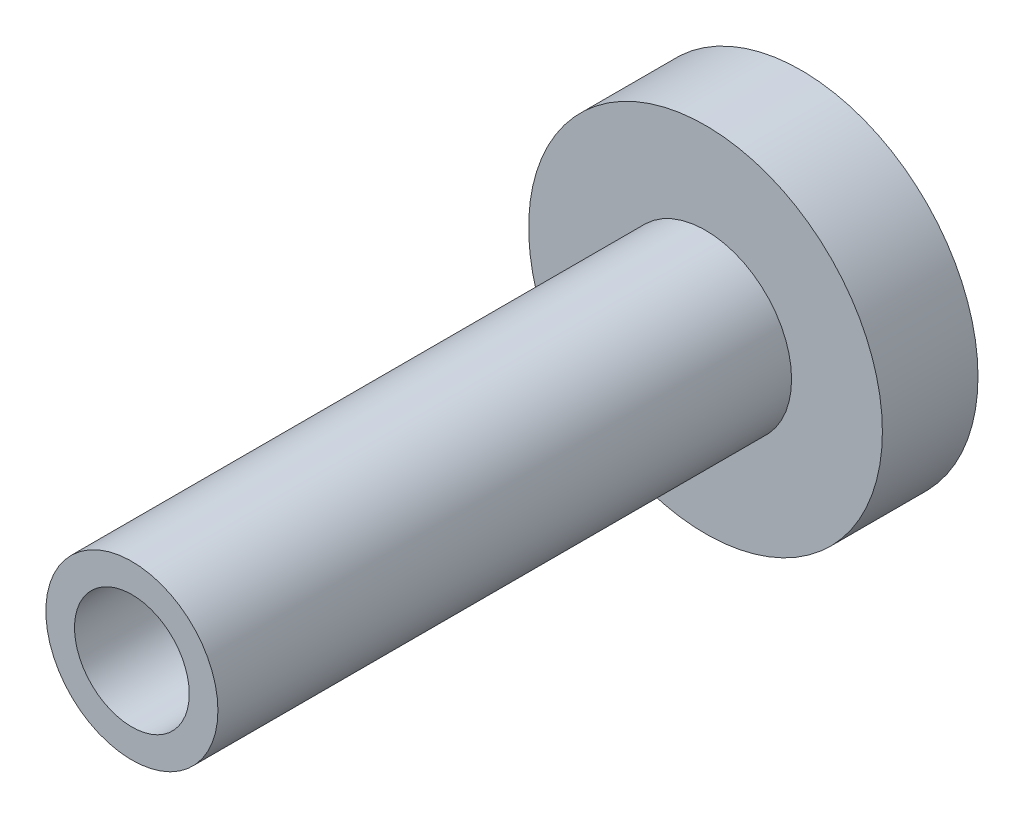
ISO-10303-21;
HEADER;
FILE_DESCRIPTION(('STEP AP214'),'2;1');
FILE_NAME('part.step','',(''),(''),'','','');
FILE_SCHEMA(('AUTOMOTIVE_DESIGN { 1 0 10303 214 1 1 1 1 }'));
ENDSEC;
DATA;
#1=APPLICATION_CONTEXT('core data for automotive mechanical design processes');
#2=APPLICATION_PROTOCOL_DEFINITION('international standard','automotive_design',2000,#1);
#3=PRODUCT_CONTEXT('',#1,'mechanical');
#4=PRODUCT('Part','Part','',(#3));
#5=PRODUCT_RELATED_PRODUCT_CATEGORY('part','',(#4));
#6=PRODUCT_DEFINITION_FORMATION('','',#4);
#7=PRODUCT_DEFINITION_CONTEXT('part definition',#1,'design');
#8=PRODUCT_DEFINITION('design','',#6,#7);
#9=PRODUCT_DEFINITION_SHAPE('','',#8);
#10=(LENGTH_UNIT() NAMED_UNIT(*) SI_UNIT(.MILLI.,.METRE.));
#11=(NAMED_UNIT(*) PLANE_ANGLE_UNIT() SI_UNIT($,.RADIAN.));
#12=(NAMED_UNIT(*) SI_UNIT($,.STERADIAN.) SOLID_ANGLE_UNIT());
#13=UNCERTAINTY_MEASURE_WITH_UNIT(LENGTH_MEASURE(1.E-05),#10,'distance_accuracy_value','');
#14=(GEOMETRIC_REPRESENTATION_CONTEXT(3) GLOBAL_UNCERTAINTY_ASSIGNED_CONTEXT((#13)) GLOBAL_UNIT_ASSIGNED_CONTEXT((#10,
#11,#12)) REPRESENTATION_CONTEXT('',''));
#15=CARTESIAN_POINT('',(0.,0.,0.));
#16=DIRECTION('',(0.,0.,1.));
#17=DIRECTION('',(1.,0.,0.));
#18=AXIS2_PLACEMENT_3D('',#15,#16,#17);
#19=CARTESIAN_POINT('',(0.,0.,5.));
#20=DIRECTION('',(0.,0.,-1.));
#21=DIRECTION('',(-1.,0.,0.));
#22=AXIS2_PLACEMENT_3D('',#19,#20,#21);
#23=CYLINDRICAL_SURFACE('',#22,9.25);
#24=CARTESIAN_POINT('',(0.,0.,5.));
#25=DIRECTION('',(0.,0.,1.));
#26=DIRECTION('',(1.,0.,0.));
#27=AXIS2_PLACEMENT_3D('',#24,#25,#26);
#28=CIRCLE('',#27,9.25);
#29=CARTESIAN_POINT('',(9.25,0.,5.));
#30=VERTEX_POINT('',#29);
#31=EDGE_CURVE('E50',#30,#30,#28,.T.);
#32=ORIENTED_EDGE('',*,*,#31,.F.);
#33=EDGE_LOOP('',(#32));
#34=FACE_BOUND('',#33,.T.);
#35=CARTESIAN_POINT('',(0.,0.,0.));
#36=DIRECTION('',(0.,0.,1.));
#37=DIRECTION('',(1.,0.,0.));
#38=AXIS2_PLACEMENT_3D('',#35,#36,#37);
#39=CIRCLE('',#38,9.25);
#40=CARTESIAN_POINT('',(9.25,0.,0.));
#41=VERTEX_POINT('',#40);
#42=EDGE_CURVE('E46',#41,#41,#39,.T.);
#43=ORIENTED_EDGE('',*,*,#42,.T.);
#44=EDGE_LOOP('',(#43));
#45=FACE_BOUND('',#44,.T.);
#46=ADVANCED_FACE('F43',(#34,#45),#23,.T.);
#47=CARTESIAN_POINT('',(0.,0.,5.));
#48=DIRECTION('',(0.,0.,1.));
#49=DIRECTION('',(1.,0.,0.));
#50=AXIS2_PLACEMENT_3D('',#47,#48,#49);
#51=PLANE('',#50);
#52=CARTESIAN_POINT('',(0.,0.,5.));
#53=DIRECTION('',(0.,0.,1.));
#54=DIRECTION('',(1.,0.,0.));
#55=AXIS2_PLACEMENT_3D('',#52,#53,#54);
#56=CIRCLE('',#55,4.5);
#57=CARTESIAN_POINT('',(4.5,0.,5.));
#58=VERTEX_POINT('',#57);
#59=EDGE_CURVE('E59',#58,#58,#56,.F.);
#60=ORIENTED_EDGE('',*,*,#59,.T.);
#61=EDGE_LOOP('',(#60));
#62=FACE_BOUND('',#61,.T.);
#63=ORIENTED_EDGE('',*,*,#31,.T.);
#64=EDGE_LOOP('',(#63));
#65=FACE_BOUND('',#64,.T.);
#66=ADVANCED_FACE('F84',(#62,#65),#51,.T.);
#67=CARTESIAN_POINT('',(0.,0.,0.));
#68=DIRECTION('',(0.,0.,1.));
#69=DIRECTION('',(1.,0.,0.));
#70=AXIS2_PLACEMENT_3D('',#67,#68,#69);
#71=PLANE('',#70);
#72=ORIENTED_EDGE('',*,*,#42,.F.);
#73=EDGE_LOOP('',(#72));
#74=FACE_BOUND('',#73,.T.);
#75=ADVANCED_FACE('F76',(#74),#71,.F.);
#76=CARTESIAN_POINT('',(0.,0.,35.));
#77=DIRECTION('',(0.,0.,1.));
#78=DIRECTION('',(1.,0.,0.));
#79=AXIS2_PLACEMENT_3D('',#76,#77,#78);
#80=PLANE('',#79);
#81=CARTESIAN_POINT('',(0.,0.,35.));
#82=DIRECTION('',(0.,0.,1.));
#83=DIRECTION('',(1.,0.,0.));
#84=AXIS2_PLACEMENT_3D('',#81,#82,#83);
#85=CIRCLE('',#84,4.5);
#86=CARTESIAN_POINT('',(4.5,0.,35.));
#87=VERTEX_POINT('',#86);
#88=EDGE_CURVE('E57',#87,#87,#85,.T.);
#89=ORIENTED_EDGE('',*,*,#88,.T.);
#90=EDGE_LOOP('',(#89));
#91=FACE_BOUND('',#90,.T.);
#92=CARTESIAN_POINT('',(0.,0.,35.));
#93=DIRECTION('',(0.,0.,1.));
#94=DIRECTION('',(1.,0.,0.));
#95=AXIS2_PLACEMENT_3D('',#92,#93,#94);
#96=CIRCLE('',#95,3.);
#97=CARTESIAN_POINT('',(3.,0.,35.));
#98=VERTEX_POINT('',#97);
#99=EDGE_CURVE('E65',#98,#98,#96,.T.);
#100=ORIENTED_EDGE('',*,*,#99,.F.);
#101=EDGE_LOOP('',(#100));
#102=FACE_BOUND('',#101,.T.);
#103=ADVANCED_FACE('F73',(#91,#102),#80,.T.);
#104=CARTESIAN_POINT('',(0.,0.,35.));
#105=DIRECTION('',(0.,0.,-1.));
#106=DIRECTION('',(-1.,0.,0.));
#107=AXIS2_PLACEMENT_3D('',#104,#105,#106);
#108=CYLINDRICAL_SURFACE('',#107,4.5);
#109=ORIENTED_EDGE('',*,*,#59,.F.);
#110=EDGE_LOOP('',(#109));
#111=FACE_BOUND('',#110,.T.);
#112=ORIENTED_EDGE('',*,*,#88,.F.);
#113=EDGE_LOOP('',(#112));
#114=FACE_BOUND('',#113,.T.);
#115=ADVANCED_FACE('F75',(#111,#114),#108,.T.);
#116=CARTESIAN_POINT('',(0.,0.,35.));
#117=DIRECTION('',(0.,0.,-1.));
#118=DIRECTION('',(-1.,0.,0.));
#119=AXIS2_PLACEMENT_3D('',#116,#117,#118);
#120=CYLINDRICAL_SURFACE('',#119,3.);
#121=CARTESIAN_POINT('',(0.,0.,5.));
#122=DIRECTION('',(0.,0.,1.));
#123=DIRECTION('',(1.,0.,0.));
#124=AXIS2_PLACEMENT_3D('',#121,#122,#123);
#125=CIRCLE('',#124,3.);
#126=CARTESIAN_POINT('',(3.,0.,5.));
#127=VERTEX_POINT('',#126);
#128=EDGE_CURVE('E11',#127,#127,#125,.F.);
#129=ORIENTED_EDGE('',*,*,#128,.T.);
#130=EDGE_LOOP('',(#129));
#131=FACE_BOUND('',#130,.T.);
#132=ORIENTED_EDGE('',*,*,#99,.T.);
#133=EDGE_LOOP('',(#132));
#134=FACE_BOUND('',#133,.T.);
#135=ADVANCED_FACE('F71',(#131,#134),#120,.F.);
#136=ORIENTED_EDGE('',*,*,#128,.F.);
#137=EDGE_LOOP('',(#136));
#138=FACE_BOUND('',#137,.T.);
#139=ADVANCED_FACE('F93',(#138),#51,.T.);
#140=CLOSED_SHELL('',(#46,#66,#75,#103,#115,#135,#139));
#141=MANIFOLD_SOLID_BREP('B2',#140);
#142=ADVANCED_BREP_SHAPE_REPRESENTATION('',(#18,#141),#14);
#143=SHAPE_DEFINITION_REPRESENTATION(#9,#142);
ENDSEC;
END-ISO-10303-21;
